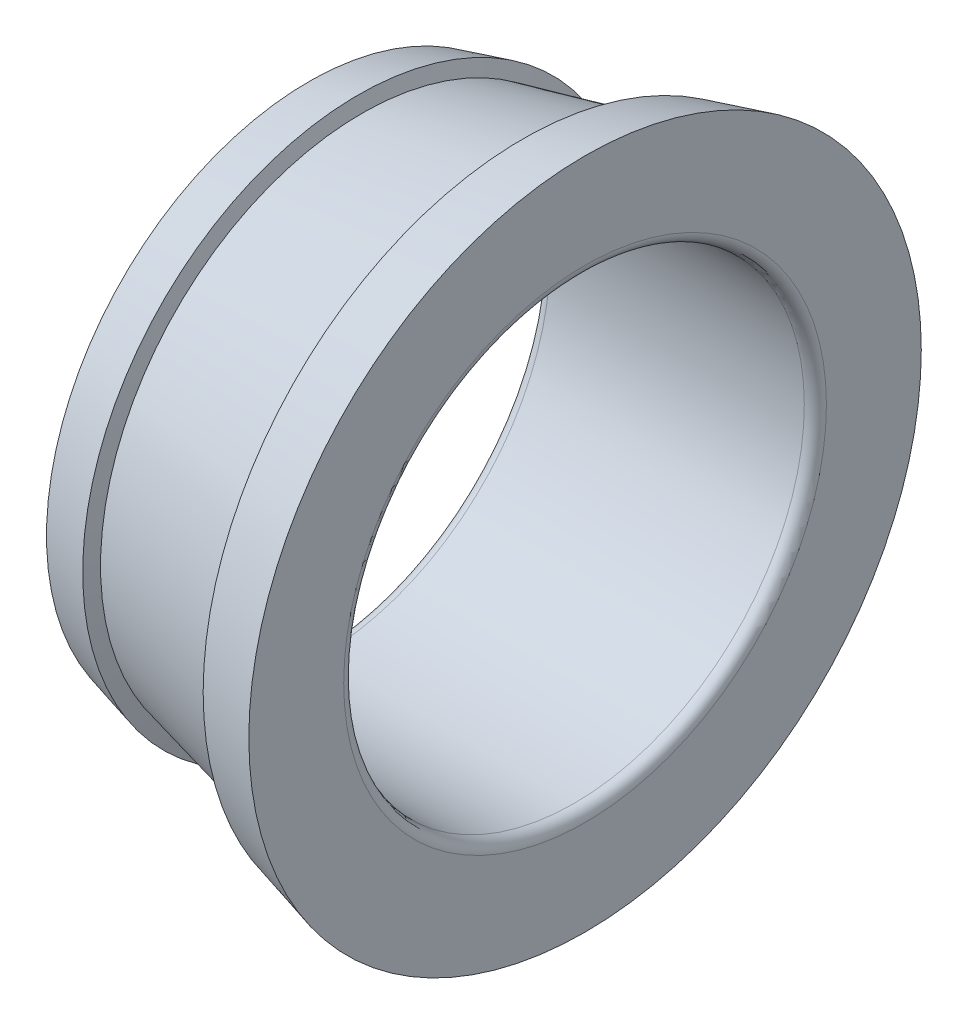
ISO-10303-21;
HEADER;
FILE_DESCRIPTION(('STEP AP214'),'2;1');
FILE_NAME('part.step','',(''),(''),'','','');
FILE_SCHEMA(('AUTOMOTIVE_DESIGN { 1 0 10303 214 1 1 1 1 }'));
ENDSEC;
DATA;
#1=APPLICATION_CONTEXT('core data for automotive mechanical design processes');
#2=APPLICATION_PROTOCOL_DEFINITION('international standard','automotive_design',2000,#1);
#3=PRODUCT_CONTEXT('',#1,'mechanical');
#4=PRODUCT('Part','Part','',(#3));
#5=PRODUCT_RELATED_PRODUCT_CATEGORY('part','',(#4));
#6=PRODUCT_DEFINITION_FORMATION('','',#4);
#7=PRODUCT_DEFINITION_CONTEXT('part definition',#1,'design');
#8=PRODUCT_DEFINITION('design','',#6,#7);
#9=PRODUCT_DEFINITION_SHAPE('','',#8);
#10=(LENGTH_UNIT() NAMED_UNIT(*) SI_UNIT(.MILLI.,.METRE.));
#11=(NAMED_UNIT(*) PLANE_ANGLE_UNIT() SI_UNIT($,.RADIAN.));
#12=(NAMED_UNIT(*) SI_UNIT($,.STERADIAN.) SOLID_ANGLE_UNIT());
#13=UNCERTAINTY_MEASURE_WITH_UNIT(LENGTH_MEASURE(1.E-05),#10,'distance_accuracy_value','');
#14=(GEOMETRIC_REPRESENTATION_CONTEXT(3) GLOBAL_UNCERTAINTY_ASSIGNED_CONTEXT((#13)) GLOBAL_UNIT_ASSIGNED_CONTEXT((#10,
#11,#12)) REPRESENTATION_CONTEXT('',''));
#15=CARTESIAN_POINT('',(0.,0.,0.));
#16=DIRECTION('',(0.,0.,1.));
#17=DIRECTION('',(1.,0.,0.));
#18=AXIS2_PLACEMENT_3D('',#15,#16,#17);
#19=CARTESIAN_POINT('',(-0.6,0.,0.));
#20=DIRECTION('',(1.,0.,0.));
#21=DIRECTION('',(0.,0.,-1.));
#22=AXIS2_PLACEMENT_3D('',#19,#20,#21);
#23=TOROIDAL_SURFACE('',#22,13.1,0.6);
#24=CARTESIAN_POINT('',(0.,0.,0.));
#25=DIRECTION('',(1.,0.,0.));
#26=DIRECTION('',(0.,0.,-1.));
#27=AXIS2_PLACEMENT_3D('',#24,#25,#26);
#28=CIRCLE('',#27,13.1);
#29=CARTESIAN_POINT('',(0.,0.,-13.1));
#30=VERTEX_POINT('',#29);
#31=EDGE_CURVE('E65',#30,#30,#28,.T.);
#32=ORIENTED_EDGE('',*,*,#31,.T.);
#33=EDGE_LOOP('',(#32));
#34=FACE_BOUND('',#33,.T.);
#35=CARTESIAN_POINT('',(-0.600000000000004,0.,0.));
#36=DIRECTION('',(1.,0.,0.));
#37=DIRECTION('',(0.,0.,-1.));
#38=AXIS2_PLACEMENT_3D('',#35,#36,#37);
#39=CIRCLE('',#38,12.5);
#40=CARTESIAN_POINT('',(-0.600000000000004,0.,-12.5));
#41=VERTEX_POINT('',#40);
#42=EDGE_CURVE('E10',#41,#41,#39,.T.);
#43=ORIENTED_EDGE('',*,*,#42,.F.);
#44=EDGE_LOOP('',(#43));
#45=FACE_BOUND('',#44,.T.);
#46=ADVANCED_FACE('F31',(#34,#45),#23,.T.);
#47=CARTESIAN_POINT('',(0.,0.,0.));
#48=DIRECTION('',(1.,0.,0.));
#49=DIRECTION('',(0.,0.,-1.));
#50=AXIS2_PLACEMENT_3D('',#47,#48,#49);
#51=CYLINDRICAL_SURFACE('',#50,12.5);
#52=ORIENTED_EDGE('',*,*,#42,.T.);
#53=EDGE_LOOP('',(#52));
#54=FACE_BOUND('',#53,.T.);
#55=CARTESIAN_POINT('',(-14.4,0.,0.));
#56=DIRECTION('',(1.,0.,0.));
#57=DIRECTION('',(0.,0.,-1.));
#58=AXIS2_PLACEMENT_3D('',#55,#56,#57);
#59=CIRCLE('',#58,12.5);
#60=CARTESIAN_POINT('',(-14.4,0.,-12.5));
#61=VERTEX_POINT('',#60);
#62=EDGE_CURVE('E37',#61,#61,#59,.T.);
#63=ORIENTED_EDGE('',*,*,#62,.F.);
#64=EDGE_LOOP('',(#63));
#65=FACE_BOUND('',#64,.T.);
#66=ADVANCED_FACE('F83',(#54,#65),#51,.F.);
#67=CARTESIAN_POINT('',(-14.4,0.,0.));
#68=DIRECTION('',(1.,0.,0.));
#69=DIRECTION('',(0.,0.,-1.));
#70=AXIS2_PLACEMENT_3D('',#67,#68,#69);
#71=TOROIDAL_SURFACE('',#70,13.1,0.6);
#72=ORIENTED_EDGE('',*,*,#62,.T.);
#73=EDGE_LOOP('',(#72));
#74=FACE_BOUND('',#73,.T.);
#75=CARTESIAN_POINT('',(-15.,0.,0.));
#76=DIRECTION('',(1.,0.,0.));
#77=DIRECTION('',(0.,0.,-1.));
#78=AXIS2_PLACEMENT_3D('',#75,#76,#77);
#79=CIRCLE('',#78,13.1);
#80=CARTESIAN_POINT('',(-15.,0.,-13.1));
#81=VERTEX_POINT('',#80);
#82=EDGE_CURVE('E41',#81,#81,#79,.T.);
#83=ORIENTED_EDGE('',*,*,#82,.F.);
#84=EDGE_LOOP('',(#83));
#85=FACE_BOUND('',#84,.T.);
#86=ADVANCED_FACE('F87',(#74,#85),#71,.T.);
#87=CARTESIAN_POINT('',(-15.,13.1,0.));
#88=DIRECTION('',(-1.,0.,0.));
#89=DIRECTION('',(0.,0.,1.));
#90=AXIS2_PLACEMENT_3D('',#87,#88,#89);
#91=PLANE('',#90);
#92=ORIENTED_EDGE('',*,*,#82,.T.);
#93=EDGE_LOOP('',(#92));
#94=FACE_BOUND('',#93,.T.);
#95=CARTESIAN_POINT('',(-15.,0.,0.));
#96=DIRECTION('',(1.,0.,0.));
#97=DIRECTION('',(0.,0.,-1.));
#98=AXIS2_PLACEMENT_3D('',#95,#96,#97);
#99=CIRCLE('',#98,14.2307621135333);
#100=CARTESIAN_POINT('',(-15.,0.,-14.2307621135333));
#101=VERTEX_POINT('',#100);
#102=EDGE_CURVE('E45',#101,#101,#99,.T.);
#103=ORIENTED_EDGE('',*,*,#102,.F.);
#104=EDGE_LOOP('',(#103));
#105=FACE_BOUND('',#104,.T.);
#106=ADVANCED_FACE('F91',(#94,#105),#91,.T.);
#107=CARTESIAN_POINT('',(-12.3162962177463,0.,0.));
#108=DIRECTION('',(1.,0.,0.));
#109=DIRECTION('',(0.,0.,-1.));
#110=AXIS2_PLACEMENT_3D('',#107,#108,#109);
#111=CONICAL_SURFACE('',#110,14.9498583747125,0.261799387799143);
#112=ORIENTED_EDGE('',*,*,#102,.T.);
#113=EDGE_LOOP('',(#112));
#114=FACE_BOUND('',#113,.T.);
#115=CARTESIAN_POINT('',(-12.3162962177463,0.,0.));
#116=DIRECTION('',(1.,0.,0.));
#117=DIRECTION('',(0.,0.,-1.));
#118=AXIS2_PLACEMENT_3D('',#115,#116,#117);
#119=CIRCLE('',#118,14.9498583747125);
#120=CARTESIAN_POINT('',(-12.3162962177463,0.,-14.9498583747125));
#121=VERTEX_POINT('',#120);
#122=EDGE_CURVE('E50',#121,#121,#119,.T.);
#123=ORIENTED_EDGE('',*,*,#122,.F.);
#124=EDGE_LOOP('',(#123));
#125=FACE_BOUND('',#124,.T.);
#126=ADVANCED_FACE('F97',(#114,#125),#111,.T.);
#127=CARTESIAN_POINT('',(-12.1117727500582,0.,0.));
#128=DIRECTION('',(-1.,0.,0.));
#129=DIRECTION('',(0.,0.,1.));
#130=AXIS2_PLACEMENT_3D('',#127,#128,#129);
#131=CONICAL_SURFACE('',#130,14.1865664019602,1.30899693899575);
#132=ORIENTED_EDGE('',*,*,#122,.T.);
#133=EDGE_LOOP('',(#132));
#134=FACE_BOUND('',#133,.T.);
#135=CARTESIAN_POINT('',(-12.1117727500582,0.,0.));
#136=DIRECTION('',(1.,0.,0.));
#137=DIRECTION('',(0.,0.,-1.));
#138=AXIS2_PLACEMENT_3D('',#135,#136,#137);
#139=CIRCLE('',#138,14.1865664019602);
#140=CARTESIAN_POINT('',(-12.1117727500582,0.,-14.1865664019602));
#141=VERTEX_POINT('',#140);
#142=EDGE_CURVE('E53',#141,#141,#139,.T.);
#143=ORIENTED_EDGE('',*,*,#142,.F.);
#144=EDGE_LOOP('',(#143));
#145=FACE_BOUND('',#144,.T.);
#146=ADVANCED_FACE('F101',(#134,#145),#131,.T.);
#147=CARTESIAN_POINT('',(-3.10801460929904,0.,0.));
#148=DIRECTION('',(1.,0.,0.));
#149=DIRECTION('',(0.,0.,-1.));
#150=AXIS2_PLACEMENT_3D('',#147,#148,#149);
#151=CONICAL_SURFACE('',#150,16.3066700179925,0.23125612588925);
#152=ORIENTED_EDGE('',*,*,#142,.T.);
#153=EDGE_LOOP('',(#152));
#154=FACE_BOUND('',#153,.T.);
#155=CARTESIAN_POINT('',(-3.10801460929904,0.,0.));
#156=DIRECTION('',(1.,0.,0.));
#157=DIRECTION('',(0.,0.,-1.));
#158=AXIS2_PLACEMENT_3D('',#155,#156,#157);
#159=CIRCLE('',#158,16.3066700179925);
#160=CARTESIAN_POINT('',(-3.10801460929904,0.,-16.3066700179925));
#161=VERTEX_POINT('',#160);
#162=EDGE_CURVE('E56',#161,#161,#159,.T.);
#163=ORIENTED_EDGE('',*,*,#162,.F.);
#164=EDGE_LOOP('',(#163));
#165=FACE_BOUND('',#164,.T.);
#166=ADVANCED_FACE('F105',(#154,#165),#151,.T.);
#167=CARTESIAN_POINT('',(-3.38564960364446,0.,0.));
#168=DIRECTION('',(-1.,0.,0.));
#169=DIRECTION('',(0.,0.,1.));
#170=AXIS2_PLACEMENT_3D('',#167,#168,#169);
#171=CONICAL_SURFACE('',#170,17.3428179228487,1.30899693899575);
#172=ORIENTED_EDGE('',*,*,#162,.T.);
#173=EDGE_LOOP('',(#172));
#174=FACE_BOUND('',#173,.T.);
#175=CARTESIAN_POINT('',(-3.38564960364446,0.,0.));
#176=DIRECTION('',(1.,0.,0.));
#177=DIRECTION('',(0.,0.,-1.));
#178=AXIS2_PLACEMENT_3D('',#175,#176,#177);
#179=CIRCLE('',#178,17.3428179228487);
#180=CARTESIAN_POINT('',(-3.38564960364446,0.,-17.3428179228487));
#181=VERTEX_POINT('',#180);
#182=EDGE_CURVE('E59',#181,#181,#179,.T.);
#183=ORIENTED_EDGE('',*,*,#182,.F.);
#184=EDGE_LOOP('',(#183));
#185=FACE_BOUND('',#184,.T.);
#186=ADVANCED_FACE('F79',(#174,#185),#171,.F.);
#187=CARTESIAN_POINT('',(0.,0.,0.));
#188=DIRECTION('',(1.,0.,0.));
#189=DIRECTION('',(0.,0.,-1.));
#190=AXIS2_PLACEMENT_3D('',#187,#188,#189);
#191=CONICAL_SURFACE('',#190,18.25,0.261799387799143);
#192=ORIENTED_EDGE('',*,*,#182,.T.);
#193=EDGE_LOOP('',(#192));
#194=FACE_BOUND('',#193,.T.);
#195=CARTESIAN_POINT('',(0.,0.,0.));
#196=DIRECTION('',(1.,0.,0.));
#197=DIRECTION('',(0.,0.,-1.));
#198=AXIS2_PLACEMENT_3D('',#195,#196,#197);
#199=CIRCLE('',#198,18.25);
#200=CARTESIAN_POINT('',(0.,0.,-18.25));
#201=VERTEX_POINT('',#200);
#202=EDGE_CURVE('E62',#201,#201,#199,.T.);
#203=ORIENTED_EDGE('',*,*,#202,.F.);
#204=EDGE_LOOP('',(#203));
#205=FACE_BOUND('',#204,.T.);
#206=ADVANCED_FACE('F73',(#194,#205),#191,.T.);
#207=CARTESIAN_POINT('',(0.,13.1,0.));
#208=DIRECTION('',(1.,0.,0.));
#209=DIRECTION('',(0.,0.,-1.));
#210=AXIS2_PLACEMENT_3D('',#207,#208,#209);
#211=PLANE('',#210);
#212=ORIENTED_EDGE('',*,*,#202,.T.);
#213=EDGE_LOOP('',(#212));
#214=FACE_BOUND('',#213,.T.);
#215=ORIENTED_EDGE('',*,*,#31,.F.);
#216=EDGE_LOOP('',(#215));
#217=FACE_BOUND('',#216,.T.);
#218=ADVANCED_FACE('F71',(#214,#217),#211,.T.);
#219=CLOSED_SHELL('',(#46,#66,#86,#106,#126,#146,#166,#186,#206,#218));
#220=MANIFOLD_SOLID_BREP('B2',#219);
#221=ADVANCED_BREP_SHAPE_REPRESENTATION('',(#18,#220),#14);
#222=SHAPE_DEFINITION_REPRESENTATION(#9,#221);
ENDSEC;
END-ISO-10303-21;
